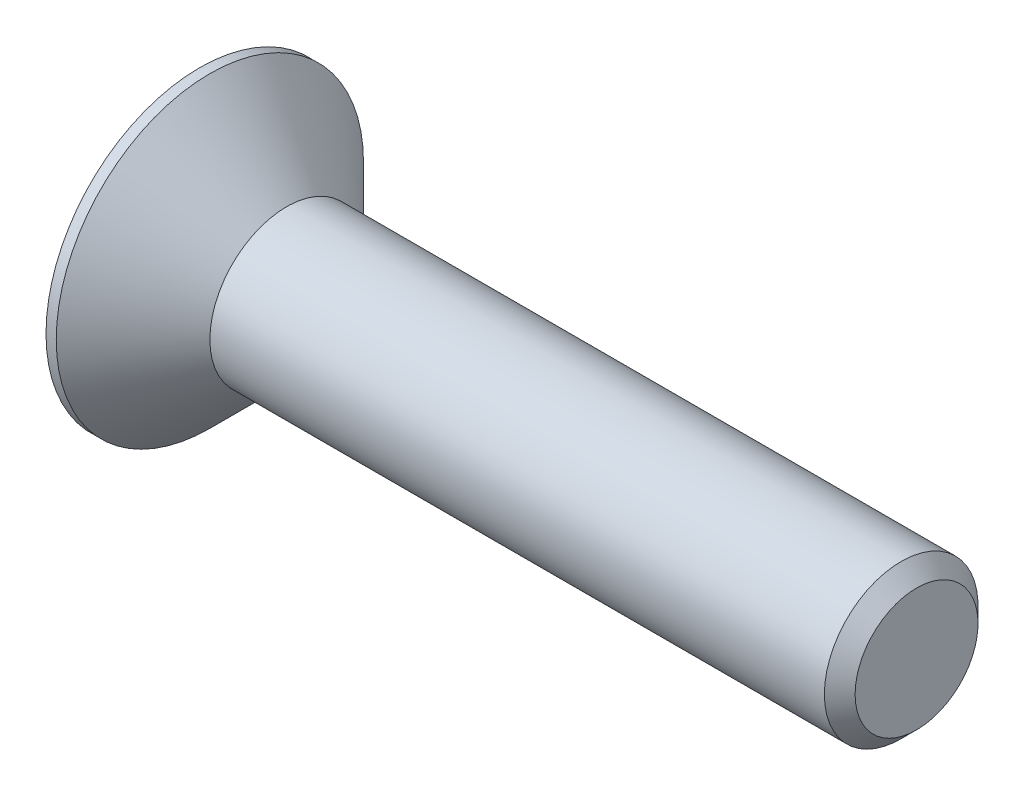
ISO-10303-21;
HEADER;
FILE_DESCRIPTION(('STEP AP214'),'2;1');
FILE_NAME('part.step','',(''),(''),'','','');
FILE_SCHEMA(('AUTOMOTIVE_DESIGN { 1 0 10303 214 1 1 1 1 }'));
ENDSEC;
DATA;
#1=APPLICATION_CONTEXT('core data for automotive mechanical design processes');
#2=APPLICATION_PROTOCOL_DEFINITION('international standard','automotive_design',2000,#1);
#3=PRODUCT_CONTEXT('',#1,'mechanical');
#4=PRODUCT('Part','Part','',(#3));
#5=PRODUCT_RELATED_PRODUCT_CATEGORY('part','',(#4));
#6=PRODUCT_DEFINITION_FORMATION('','',#4);
#7=PRODUCT_DEFINITION_CONTEXT('part definition',#1,'design');
#8=PRODUCT_DEFINITION('design','',#6,#7);
#9=PRODUCT_DEFINITION_SHAPE('','',#8);
#10=(LENGTH_UNIT() NAMED_UNIT(*) SI_UNIT(.MILLI.,.METRE.));
#11=(NAMED_UNIT(*) PLANE_ANGLE_UNIT() SI_UNIT($,.RADIAN.));
#12=(NAMED_UNIT(*) SI_UNIT($,.STERADIAN.) SOLID_ANGLE_UNIT());
#13=UNCERTAINTY_MEASURE_WITH_UNIT(LENGTH_MEASURE(1.E-05),#10,'distance_accuracy_value','');
#14=(GEOMETRIC_REPRESENTATION_CONTEXT(3) GLOBAL_UNCERTAINTY_ASSIGNED_CONTEXT((#13)) GLOBAL_UNIT_ASSIGNED_CONTEXT((#10,
#11,#12)) REPRESENTATION_CONTEXT('',''));
#15=CARTESIAN_POINT('',(0.,0.,0.));
#16=DIRECTION('',(0.,0.,1.));
#17=DIRECTION('',(1.,0.,0.));
#18=AXIS2_PLACEMENT_3D('',#15,#16,#17);
#19=CARTESIAN_POINT('',(0.,3.,0.));
#20=DIRECTION('',(1.,0.,0.));
#21=DIRECTION('',(0.,0.,-1.));
#22=AXIS2_PLACEMENT_3D('',#19,#20,#21);
#23=PLANE('',#22);
#24=DIRECTION('',(0.,0.866025403784439,0.5));
#25=VECTOR('',#24,1.);
#26=CARTESIAN_POINT('',(0.,-1.,0.577350269189626));
#27=LINE('',#26,#25);
#28=CARTESIAN_POINT('',(0.,-1.,0.577350269189626));
#29=VERTEX_POINT('',#28);
#30=CARTESIAN_POINT('',(0.,0.,1.15470053837925));
#31=VERTEX_POINT('',#30);
#32=EDGE_CURVE('E133',#29,#31,#27,.T.);
#33=ORIENTED_EDGE('',*,*,#32,.F.);
#34=DIRECTION('',(0.,0.,1.));
#35=VECTOR('',#34,1.);
#36=CARTESIAN_POINT('',(0.,-1.,-0.577350269189626));
#37=LINE('',#36,#35);
#38=CARTESIAN_POINT('',(0.,-1.,-0.577350269189626));
#39=VERTEX_POINT('',#38);
#40=EDGE_CURVE('E59',#39,#29,#37,.T.);
#41=ORIENTED_EDGE('',*,*,#40,.F.);
#42=DIRECTION('',(0.,-0.866025403784439,0.5));
#43=VECTOR('',#42,1.);
#44=CARTESIAN_POINT('',(0.,0.,-1.15470053837925));
#45=LINE('',#44,#43);
#46=CARTESIAN_POINT('',(0.,0.,-1.15470053837925));
#47=VERTEX_POINT('',#46);
#48=EDGE_CURVE('E142',#47,#39,#45,.T.);
#49=ORIENTED_EDGE('',*,*,#48,.F.);
#50=DIRECTION('',(0.,-0.866025403784438,-0.5));
#51=VECTOR('',#50,1.);
#52=CARTESIAN_POINT('',(0.,1.,-0.577350269189626));
#53=LINE('',#52,#51);
#54=CARTESIAN_POINT('',(0.,1.,-0.577350269189626));
#55=VERTEX_POINT('',#54);
#56=EDGE_CURVE('E140',#55,#47,#53,.T.);
#57=ORIENTED_EDGE('',*,*,#56,.F.);
#58=DIRECTION('',(0.,0.,-1.));
#59=VECTOR('',#58,1.);
#60=CARTESIAN_POINT('',(0.,1.,0.577350269189626));
#61=LINE('',#60,#59);
#62=CARTESIAN_POINT('',(0.,1.,0.577350269189626));
#63=VERTEX_POINT('',#62);
#64=EDGE_CURVE('E107',#63,#55,#61,.T.);
#65=ORIENTED_EDGE('',*,*,#64,.F.);
#66=DIRECTION('',(0.,0.866025403784438,-0.5));
#67=VECTOR('',#66,1.);
#68=CARTESIAN_POINT('',(0.,0.,1.15470053837925));
#69=LINE('',#68,#67);
#70=EDGE_CURVE('E136',#31,#63,#69,.T.);
#71=ORIENTED_EDGE('',*,*,#70,.F.);
#72=EDGE_LOOP('',(#33,#41,#49,#57,#65,#71));
#73=FACE_BOUND('',#72,.T.);
#74=CARTESIAN_POINT('',(0.,0.,0.));
#75=DIRECTION('',(-1.,0.,0.));
#76=DIRECTION('',(0.,0.,1.));
#77=AXIS2_PLACEMENT_3D('',#74,#75,#76);
#78=CIRCLE('',#77,3.);
#79=CARTESIAN_POINT('',(0.,0.,3.));
#80=VERTEX_POINT('',#79);
#81=EDGE_CURVE('E146',#80,#80,#78,.T.);
#82=ORIENTED_EDGE('',*,*,#81,.T.);
#83=EDGE_LOOP('',(#82));
#84=FACE_BOUND('',#83,.T.);
#85=ADVANCED_FACE('F43',(#73,#84),#23,.F.);
#86=CARTESIAN_POINT('',(14.,0.,0.));
#87=DIRECTION('',(-1.,0.,0.));
#88=DIRECTION('',(0.,0.,1.));
#89=AXIS2_PLACEMENT_3D('',#86,#87,#88);
#90=PLANE('',#89);
#91=CARTESIAN_POINT('',(14.,0.,0.));
#92=DIRECTION('',(-1.,0.,0.));
#93=DIRECTION('',(0.,0.,1.));
#94=AXIS2_PLACEMENT_3D('',#91,#92,#93);
#95=CIRCLE('',#94,1.2);
#96=CARTESIAN_POINT('',(14.,0.,1.2));
#97=VERTEX_POINT('',#96);
#98=EDGE_CURVE('E11',#97,#97,#95,.F.);
#99=ORIENTED_EDGE('',*,*,#98,.T.);
#100=EDGE_LOOP('',(#99));
#101=FACE_BOUND('',#100,.T.);
#102=ADVANCED_FACE('F181',(#101),#90,.F.);
#103=CARTESIAN_POINT('',(0.,0.,0.));
#104=DIRECTION('',(-1.,0.,0.));
#105=DIRECTION('',(0.,0.,1.));
#106=AXIS2_PLACEMENT_3D('',#103,#104,#105);
#107=CYLINDRICAL_SURFACE('',#106,1.5);
#108=CARTESIAN_POINT('',(13.7,0.,0.));
#109=DIRECTION('',(-1.,0.,0.));
#110=DIRECTION('',(0.,0.,1.));
#111=AXIS2_PLACEMENT_3D('',#108,#109,#110);
#112=CIRCLE('',#111,1.5);
#113=CARTESIAN_POINT('',(13.7,0.,1.5));
#114=VERTEX_POINT('',#113);
#115=EDGE_CURVE('E52',#114,#114,#112,.T.);
#116=ORIENTED_EDGE('',*,*,#115,.T.);
#117=EDGE_LOOP('',(#116));
#118=FACE_BOUND('',#117,.T.);
#119=CARTESIAN_POINT('',(1.7,0.,0.));
#120=DIRECTION('',(-1.,0.,0.));
#121=DIRECTION('',(0.,0.,1.));
#122=AXIS2_PLACEMENT_3D('',#119,#120,#121);
#123=CIRCLE('',#122,1.5);
#124=CARTESIAN_POINT('',(1.7,0.,1.5));
#125=VERTEX_POINT('',#124);
#126=EDGE_CURVE('E157',#125,#125,#123,.T.);
#127=ORIENTED_EDGE('',*,*,#126,.F.);
#128=EDGE_LOOP('',(#127));
#129=FACE_BOUND('',#128,.T.);
#130=ADVANCED_FACE('F162',(#118,#129),#107,.T.);
#131=CARTESIAN_POINT('',(1.7,0.,0.));
#132=DIRECTION('',(-1.,0.,0.));
#133=DIRECTION('',(0.,0.,1.));
#134=AXIS2_PLACEMENT_3D('',#131,#132,#133);
#135=CONICAL_SURFACE('',#134,1.5,0.785398163397443);
#136=CARTESIAN_POINT('',(0.199999999999982,0.,0.));
#137=DIRECTION('',(-1.,0.,0.));
#138=DIRECTION('',(0.,0.,1.));
#139=AXIS2_PLACEMENT_3D('',#136,#137,#138);
#140=CIRCLE('',#139,3.);
#141=CARTESIAN_POINT('',(0.199999999999982,0.,3.));
#142=VERTEX_POINT('',#141);
#143=EDGE_CURVE('E154',#142,#142,#140,.T.);
#144=ORIENTED_EDGE('',*,*,#143,.F.);
#145=EDGE_LOOP('',(#144));
#146=FACE_BOUND('',#145,.T.);
#147=ORIENTED_EDGE('',*,*,#126,.T.);
#148=EDGE_LOOP('',(#147));
#149=FACE_BOUND('',#148,.T.);
#150=ADVANCED_FACE('F177',(#146,#149),#135,.T.);
#151=CARTESIAN_POINT('',(0.,0.,0.));
#152=DIRECTION('',(-1.,0.,0.));
#153=DIRECTION('',(0.,0.,1.));
#154=AXIS2_PLACEMENT_3D('',#151,#152,#153);
#155=CYLINDRICAL_SURFACE('',#154,3.);
#156=ORIENTED_EDGE('',*,*,#81,.F.);
#157=EDGE_LOOP('',(#156));
#158=FACE_BOUND('',#157,.T.);
#159=ORIENTED_EDGE('',*,*,#143,.T.);
#160=EDGE_LOOP('',(#159));
#161=FACE_BOUND('',#160,.T.);
#162=ADVANCED_FACE('F167',(#158,#161),#155,.T.);
#163=CARTESIAN_POINT('',(13.7,0.,0.));
#164=DIRECTION('',(-1.,0.,0.));
#165=DIRECTION('',(0.,0.,1.));
#166=AXIS2_PLACEMENT_3D('',#163,#164,#165);
#167=CONICAL_SURFACE('',#166,1.5,0.785398163397451);
#168=ORIENTED_EDGE('',*,*,#98,.F.);
#169=EDGE_LOOP('',(#168));
#170=FACE_BOUND('',#169,.T.);
#171=ORIENTED_EDGE('',*,*,#115,.F.);
#172=EDGE_LOOP('',(#171));
#173=FACE_BOUND('',#172,.T.);
#174=ADVANCED_FACE('F46',(#170,#173),#167,.T.);
#175=CARTESIAN_POINT('',(0.75,-1.,-0.577350269189626));
#176=DIRECTION('',(0.,-1.,0.));
#177=DIRECTION('',(0.,0.,-1.));
#178=AXIS2_PLACEMENT_3D('',#175,#176,#177);
#179=PLANE('',#178);
#180=ORIENTED_EDGE('',*,*,#40,.T.);
#181=DIRECTION('',(-1.,0.,0.));
#182=VECTOR('',#181,1.);
#183=CARTESIAN_POINT('',(0.75,-1.,0.577350269189626));
#184=LINE('',#183,#182);
#185=CARTESIAN_POINT('',(0.75,-1.,0.577350269189626));
#186=VERTEX_POINT('',#185);
#187=EDGE_CURVE('E89',#186,#29,#184,.T.);
#188=ORIENTED_EDGE('',*,*,#187,.F.);
#189=DIRECTION('',(0.,0.,1.));
#190=VECTOR('',#189,1.);
#191=CARTESIAN_POINT('',(0.75,-1.,-0.577350269189626));
#192=LINE('',#191,#190);
#193=CARTESIAN_POINT('',(0.75,-1.,-0.577350269189626));
#194=VERTEX_POINT('',#193);
#195=EDGE_CURVE('E144',#194,#186,#192,.T.);
#196=ORIENTED_EDGE('',*,*,#195,.F.);
#197=DIRECTION('',(-1.,0.,0.));
#198=VECTOR('',#197,1.);
#199=CARTESIAN_POINT('',(0.75,-1.,-0.577350269189626));
#200=LINE('',#199,#198);
#201=EDGE_CURVE('E67',#194,#39,#200,.T.);
#202=ORIENTED_EDGE('',*,*,#201,.T.);
#203=EDGE_LOOP('',(#180,#188,#196,#202));
#204=FACE_BOUND('',#203,.T.);
#205=ADVANCED_FACE('F166',(#204),#179,.F.);
#206=CARTESIAN_POINT('',(0.75,0.,-1.15470053837925));
#207=DIRECTION('',(0.,-0.5,-0.866025403784438));
#208=DIRECTION('',(0.,0.866025403784439,-0.5));
#209=AXIS2_PLACEMENT_3D('',#206,#207,#208);
#210=PLANE('',#209);
#211=ORIENTED_EDGE('',*,*,#48,.T.);
#212=ORIENTED_EDGE('',*,*,#201,.F.);
#213=DIRECTION('',(0.,-0.866025403784439,0.5));
#214=VECTOR('',#213,1.);
#215=CARTESIAN_POINT('',(0.75,0.,-1.15470053837925));
#216=LINE('',#215,#214);
#217=CARTESIAN_POINT('',(0.75,0.,-1.15470053837925));
#218=VERTEX_POINT('',#217);
#219=EDGE_CURVE('E119',#218,#194,#216,.T.);
#220=ORIENTED_EDGE('',*,*,#219,.F.);
#221=DIRECTION('',(-1.,0.,0.));
#222=VECTOR('',#221,1.);
#223=CARTESIAN_POINT('',(0.75,0.,-1.15470053837925));
#224=LINE('',#223,#222);
#225=EDGE_CURVE('E111',#218,#47,#224,.T.);
#226=ORIENTED_EDGE('',*,*,#225,.T.);
#227=EDGE_LOOP('',(#211,#212,#220,#226));
#228=FACE_BOUND('',#227,.T.);
#229=ADVANCED_FACE('F174',(#228),#210,.F.);
#230=CARTESIAN_POINT('',(0.75,1.,-0.577350269189626));
#231=DIRECTION('',(0.,0.5,-0.866025403784439));
#232=DIRECTION('',(0.,0.866025403784439,0.5));
#233=AXIS2_PLACEMENT_3D('',#230,#231,#232);
#234=PLANE('',#233);
#235=ORIENTED_EDGE('',*,*,#56,.T.);
#236=ORIENTED_EDGE('',*,*,#225,.F.);
#237=DIRECTION('',(0.,-0.866025403784438,-0.5));
#238=VECTOR('',#237,1.);
#239=CARTESIAN_POINT('',(0.75,1.,-0.577350269189626));
#240=LINE('',#239,#238);
#241=CARTESIAN_POINT('',(0.75,1.,-0.577350269189626));
#242=VERTEX_POINT('',#241);
#243=EDGE_CURVE('E115',#242,#218,#240,.T.);
#244=ORIENTED_EDGE('',*,*,#243,.F.);
#245=DIRECTION('',(-1.,0.,0.));
#246=VECTOR('',#245,1.);
#247=CARTESIAN_POINT('',(0.75,1.,-0.577350269189626));
#248=LINE('',#247,#246);
#249=EDGE_CURVE('E100',#242,#55,#248,.T.);
#250=ORIENTED_EDGE('',*,*,#249,.T.);
#251=EDGE_LOOP('',(#235,#236,#244,#250));
#252=FACE_BOUND('',#251,.T.);
#253=ADVANCED_FACE('F116',(#252),#234,.F.);
#254=CARTESIAN_POINT('',(0.75,1.,0.577350269189626));
#255=DIRECTION('',(0.,1.,0.));
#256=DIRECTION('',(0.,0.,1.));
#257=AXIS2_PLACEMENT_3D('',#254,#255,#256);
#258=PLANE('',#257);
#259=ORIENTED_EDGE('',*,*,#64,.T.);
#260=ORIENTED_EDGE('',*,*,#249,.F.);
#261=DIRECTION('',(0.,0.,-1.));
#262=VECTOR('',#261,1.);
#263=CARTESIAN_POINT('',(0.75,1.,0.577350269189626));
#264=LINE('',#263,#262);
#265=CARTESIAN_POINT('',(0.75,1.,0.577350269189626));
#266=VERTEX_POINT('',#265);
#267=EDGE_CURVE('E104',#266,#242,#264,.T.);
#268=ORIENTED_EDGE('',*,*,#267,.F.);
#269=DIRECTION('',(-1.,0.,0.));
#270=VECTOR('',#269,1.);
#271=CARTESIAN_POINT('',(0.75,1.,0.577350269189626));
#272=LINE('',#271,#270);
#273=EDGE_CURVE('E112',#266,#63,#272,.T.);
#274=ORIENTED_EDGE('',*,*,#273,.T.);
#275=EDGE_LOOP('',(#259,#260,#268,#274));
#276=FACE_BOUND('',#275,.T.);
#277=ADVANCED_FACE('F102',(#276),#258,.F.);
#278=CARTESIAN_POINT('',(0.75,0.,1.15470053837925));
#279=DIRECTION('',(0.,0.5,0.866025403784438));
#280=DIRECTION('',(0.,-0.866025403784438,0.5));
#281=AXIS2_PLACEMENT_3D('',#278,#279,#280);
#282=PLANE('',#281);
#283=ORIENTED_EDGE('',*,*,#70,.T.);
#284=ORIENTED_EDGE('',*,*,#273,.F.);
#285=DIRECTION('',(0.,0.866025403784438,-0.5));
#286=VECTOR('',#285,1.);
#287=CARTESIAN_POINT('',(0.75,0.,1.15470053837925));
#288=LINE('',#287,#286);
#289=CARTESIAN_POINT('',(0.75,0.,1.15470053837925));
#290=VERTEX_POINT('',#289);
#291=EDGE_CURVE('E125',#290,#266,#288,.T.);
#292=ORIENTED_EDGE('',*,*,#291,.F.);
#293=DIRECTION('',(-1.,0.,0.));
#294=VECTOR('',#293,1.);
#295=CARTESIAN_POINT('',(0.75,0.,1.15470053837925));
#296=LINE('',#295,#294);
#297=EDGE_CURVE('E149',#290,#31,#296,.T.);
#298=ORIENTED_EDGE('',*,*,#297,.T.);
#299=EDGE_LOOP('',(#283,#284,#292,#298));
#300=FACE_BOUND('',#299,.T.);
#301=ADVANCED_FACE('F198',(#300),#282,.F.);
#302=CARTESIAN_POINT('',(0.75,-1.,0.577350269189626));
#303=DIRECTION('',(0.,-0.5,0.866025403784439));
#304=DIRECTION('',(0.,-0.866025403784439,-0.5));
#305=AXIS2_PLACEMENT_3D('',#302,#303,#304);
#306=PLANE('',#305);
#307=ORIENTED_EDGE('',*,*,#32,.T.);
#308=ORIENTED_EDGE('',*,*,#297,.F.);
#309=DIRECTION('',(0.,0.866025403784439,0.5));
#310=VECTOR('',#309,1.);
#311=CARTESIAN_POINT('',(0.75,-1.,0.577350269189626));
#312=LINE('',#311,#310);
#313=EDGE_CURVE('E127',#186,#290,#312,.T.);
#314=ORIENTED_EDGE('',*,*,#313,.F.);
#315=ORIENTED_EDGE('',*,*,#187,.T.);
#316=EDGE_LOOP('',(#307,#308,#314,#315));
#317=FACE_BOUND('',#316,.T.);
#318=ADVANCED_FACE('F195',(#317),#306,.F.);
#319=CARTESIAN_POINT('',(0.75,0.,0.));
#320=DIRECTION('',(-1.,0.,0.));
#321=DIRECTION('',(0.,0.,1.));
#322=AXIS2_PLACEMENT_3D('',#319,#320,#321);
#323=PLANE('',#322);
#324=ORIENTED_EDGE('',*,*,#195,.T.);
#325=ORIENTED_EDGE('',*,*,#313,.T.);
#326=ORIENTED_EDGE('',*,*,#291,.T.);
#327=ORIENTED_EDGE('',*,*,#267,.T.);
#328=ORIENTED_EDGE('',*,*,#243,.T.);
#329=ORIENTED_EDGE('',*,*,#219,.T.);
#330=EDGE_LOOP('',(#324,#325,#326,#327,#328,#329));
#331=FACE_BOUND('',#330,.T.);
#332=ADVANCED_FACE('F122',(#331),#323,.T.);
#333=CLOSED_SHELL('',(#85,#102,#130,#150,#162,#174,#205,#229,#253,#277,#301,#318,#332));
#334=MANIFOLD_SOLID_BREP('B2',#333);
#335=ADVANCED_BREP_SHAPE_REPRESENTATION('',(#18,#334),#14);
#336=SHAPE_DEFINITION_REPRESENTATION(#9,#335);
ENDSEC;
END-ISO-10303-21;
